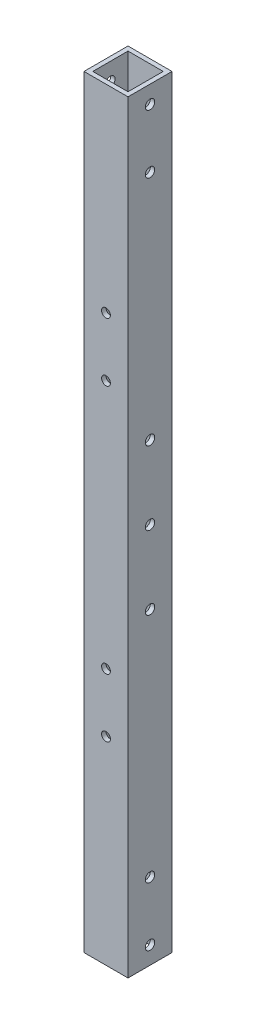
ISO-10303-21;
HEADER;
FILE_DESCRIPTION(('STEP AP214'),'2;1');
FILE_NAME('part.step','',(''),(''),'','','');
FILE_SCHEMA(('AUTOMOTIVE_DESIGN { 1 0 10303 214 1 1 1 1 }'));
ENDSEC;
DATA;
#1=APPLICATION_CONTEXT('core data for automotive mechanical design processes');
#2=APPLICATION_PROTOCOL_DEFINITION('international standard','automotive_design',2000,#1);
#3=PRODUCT_CONTEXT('',#1,'mechanical');
#4=PRODUCT('Part','Part','',(#3));
#5=PRODUCT_RELATED_PRODUCT_CATEGORY('part','',(#4));
#6=PRODUCT_DEFINITION_FORMATION('','',#4);
#7=PRODUCT_DEFINITION_CONTEXT('part definition',#1,'design');
#8=PRODUCT_DEFINITION('design','',#6,#7);
#9=PRODUCT_DEFINITION_SHAPE('','',#8);
#10=(LENGTH_UNIT() NAMED_UNIT(*) SI_UNIT(.MILLI.,.METRE.));
#11=(NAMED_UNIT(*) PLANE_ANGLE_UNIT() SI_UNIT($,.RADIAN.));
#12=(NAMED_UNIT(*) SI_UNIT($,.STERADIAN.) SOLID_ANGLE_UNIT());
#13=UNCERTAINTY_MEASURE_WITH_UNIT(LENGTH_MEASURE(1.E-05),#10,'distance_accuracy_value','');
#14=(GEOMETRIC_REPRESENTATION_CONTEXT(3) GLOBAL_UNCERTAINTY_ASSIGNED_CONTEXT((#13)) GLOBAL_UNIT_ASSIGNED_CONTEXT((#10,
#11,#12)) REPRESENTATION_CONTEXT('',''));
#15=CARTESIAN_POINT('',(0.,0.,0.));
#16=DIRECTION('',(0.,0.,1.));
#17=DIRECTION('',(1.,0.,0.));
#18=AXIS2_PLACEMENT_3D('',#15,#16,#17);
#19=CARTESIAN_POINT('',(0.,260.,0.));
#20=DIRECTION('',(0.,-1.,0.));
#21=DIRECTION('',(0.,0.,-1.));
#22=AXIS2_PLACEMENT_3D('',#19,#20,#21);
#23=PLANE('',#22);
#24=DIRECTION('',(0.,0.,-1.));
#25=VECTOR('',#24,1.);
#26=CARTESIAN_POINT('',(7.5,260.,7.5));
#27=LINE('',#26,#25);
#28=CARTESIAN_POINT('',(7.5,260.,7.5));
#29=VERTEX_POINT('',#28);
#30=CARTESIAN_POINT('',(7.5,260.,-7.5));
#31=VERTEX_POINT('',#30);
#32=EDGE_CURVE('E150',#29,#31,#27,.T.);
#33=ORIENTED_EDGE('',*,*,#32,.T.);
#34=DIRECTION('',(-1.,0.,0.));
#35=VECTOR('',#34,1.);
#36=CARTESIAN_POINT('',(-7.5,260.,-7.5));
#37=LINE('',#36,#35);
#38=CARTESIAN_POINT('',(-7.5,260.,-7.5));
#39=VERTEX_POINT('',#38);
#40=EDGE_CURVE('E153',#31,#39,#37,.T.);
#41=ORIENTED_EDGE('',*,*,#40,.T.);
#42=DIRECTION('',(0.,0.,1.));
#43=VECTOR('',#42,1.);
#44=CARTESIAN_POINT('',(-7.5,260.,7.5));
#45=LINE('',#44,#43);
#46=CARTESIAN_POINT('',(-7.5,260.,7.5));
#47=VERTEX_POINT('',#46);
#48=EDGE_CURVE('E156',#39,#47,#45,.T.);
#49=ORIENTED_EDGE('',*,*,#48,.T.);
#50=DIRECTION('',(1.,0.,0.));
#51=VECTOR('',#50,1.);
#52=CARTESIAN_POINT('',(-7.5,260.,7.5));
#53=LINE('',#52,#51);
#54=EDGE_CURVE('E158',#47,#29,#53,.T.);
#55=ORIENTED_EDGE('',*,*,#54,.T.);
#56=EDGE_LOOP('',(#33,#41,#49,#55));
#57=FACE_BOUND('',#56,.T.);
#58=DIRECTION('',(0.,0.,-1.));
#59=VECTOR('',#58,1.);
#60=CARTESIAN_POINT('',(6.,260.,6.));
#61=LINE('',#60,#59);
#62=CARTESIAN_POINT('',(6.,260.,6.));
#63=VERTEX_POINT('',#62);
#64=CARTESIAN_POINT('',(6.,260.,-6.));
#65=VERTEX_POINT('',#64);
#66=EDGE_CURVE('E112',#63,#65,#61,.T.);
#67=ORIENTED_EDGE('',*,*,#66,.F.);
#68=DIRECTION('',(1.,0.,0.));
#69=VECTOR('',#68,1.);
#70=CARTESIAN_POINT('',(-6.,260.,6.));
#71=LINE('',#70,#69);
#72=CARTESIAN_POINT('',(-6.,260.,6.));
#73=VERTEX_POINT('',#72);
#74=EDGE_CURVE('E134',#73,#63,#71,.T.);
#75=ORIENTED_EDGE('',*,*,#74,.F.);
#76=DIRECTION('',(0.,0.,1.));
#77=VECTOR('',#76,1.);
#78=CARTESIAN_POINT('',(-6.,260.,6.));
#79=LINE('',#78,#77);
#80=CARTESIAN_POINT('',(-6.,260.,-6.));
#81=VERTEX_POINT('',#80);
#82=EDGE_CURVE('E132',#81,#73,#79,.T.);
#83=ORIENTED_EDGE('',*,*,#82,.F.);
#84=DIRECTION('',(-1.,0.,0.));
#85=VECTOR('',#84,1.);
#86=CARTESIAN_POINT('',(-6.,260.,-6.));
#87=LINE('',#86,#85);
#88=EDGE_CURVE('E120',#65,#81,#87,.T.);
#89=ORIENTED_EDGE('',*,*,#88,.F.);
#90=EDGE_LOOP('',(#67,#75,#83,#89));
#91=FACE_BOUND('',#90,.T.);
#92=ADVANCED_FACE('F45',(#57,#91),#23,.F.);
#93=CARTESIAN_POINT('',(0.,0.,0.));
#94=DIRECTION('',(0.,-1.,0.));
#95=DIRECTION('',(0.,0.,-1.));
#96=AXIS2_PLACEMENT_3D('',#93,#94,#95);
#97=PLANE('',#96);
#98=DIRECTION('',(0.,0.,-1.));
#99=VECTOR('',#98,1.);
#100=CARTESIAN_POINT('',(7.5,0.,7.5));
#101=LINE('',#100,#99);
#102=CARTESIAN_POINT('',(7.5,0.,7.5));
#103=VERTEX_POINT('',#102);
#104=CARTESIAN_POINT('',(7.5,0.,-7.5));
#105=VERTEX_POINT('',#104);
#106=EDGE_CURVE('E128',#103,#105,#101,.T.);
#107=ORIENTED_EDGE('',*,*,#106,.F.);
#108=DIRECTION('',(1.,0.,0.));
#109=VECTOR('',#108,1.);
#110=CARTESIAN_POINT('',(-7.5,0.,7.5));
#111=LINE('',#110,#109);
#112=CARTESIAN_POINT('',(-7.5,0.,7.5));
#113=VERTEX_POINT('',#112);
#114=EDGE_CURVE('E154',#113,#103,#111,.T.);
#115=ORIENTED_EDGE('',*,*,#114,.F.);
#116=DIRECTION('',(0.,0.,1.));
#117=VECTOR('',#116,1.);
#118=CARTESIAN_POINT('',(-7.5,0.,7.5));
#119=LINE('',#118,#117);
#120=CARTESIAN_POINT('',(-7.5,0.,-7.5));
#121=VERTEX_POINT('',#120);
#122=EDGE_CURVE('E165',#121,#113,#119,.T.);
#123=ORIENTED_EDGE('',*,*,#122,.F.);
#124=DIRECTION('',(-1.,0.,0.));
#125=VECTOR('',#124,1.);
#126=CARTESIAN_POINT('',(-7.5,0.,-7.5));
#127=LINE('',#126,#125);
#128=EDGE_CURVE('E163',#105,#121,#127,.T.);
#129=ORIENTED_EDGE('',*,*,#128,.F.);
#130=EDGE_LOOP('',(#107,#115,#123,#129));
#131=FACE_BOUND('',#130,.T.);
#132=DIRECTION('',(1.,0.,0.));
#133=VECTOR('',#132,1.);
#134=CARTESIAN_POINT('',(-6.,0.,6.));
#135=LINE('',#134,#133);
#136=CARTESIAN_POINT('',(-6.,0.,6.));
#137=VERTEX_POINT('',#136);
#138=CARTESIAN_POINT('',(6.,0.,6.));
#139=VERTEX_POINT('',#138);
#140=EDGE_CURVE('E121',#137,#139,#135,.T.);
#141=ORIENTED_EDGE('',*,*,#140,.T.);
#142=DIRECTION('',(0.,0.,-1.));
#143=VECTOR('',#142,1.);
#144=CARTESIAN_POINT('',(6.,0.,6.));
#145=LINE('',#144,#143);
#146=CARTESIAN_POINT('',(6.,0.,-6.));
#147=VERTEX_POINT('',#146);
#148=EDGE_CURVE('E70',#139,#147,#145,.T.);
#149=ORIENTED_EDGE('',*,*,#148,.T.);
#150=DIRECTION('',(-1.,0.,0.));
#151=VECTOR('',#150,1.);
#152=CARTESIAN_POINT('',(-6.,0.,-6.));
#153=LINE('',#152,#151);
#154=CARTESIAN_POINT('',(-6.,0.,-6.));
#155=VERTEX_POINT('',#154);
#156=EDGE_CURVE('E127',#147,#155,#153,.T.);
#157=ORIENTED_EDGE('',*,*,#156,.T.);
#158=DIRECTION('',(0.,0.,1.));
#159=VECTOR('',#158,1.);
#160=CARTESIAN_POINT('',(-6.,0.,6.));
#161=LINE('',#160,#159);
#162=EDGE_CURVE('E142',#155,#137,#161,.T.);
#163=ORIENTED_EDGE('',*,*,#162,.T.);
#164=EDGE_LOOP('',(#141,#149,#157,#163));
#165=FACE_BOUND('',#164,.T.);
#166=ADVANCED_FACE('F309',(#131,#165),#97,.T.);
#167=CARTESIAN_POINT('',(7.5,260.,7.5));
#168=DIRECTION('',(-1.,0.,0.));
#169=DIRECTION('',(0.,0.,1.));
#170=AXIS2_PLACEMENT_3D('',#167,#168,#169);
#171=PLANE('',#170);
#172=CARTESIAN_POINT('',(7.5,254.,0.));
#173=DIRECTION('',(-1.,0.,0.));
#174=DIRECTION('',(0.,0.,1.));
#175=AXIS2_PLACEMENT_3D('',#172,#173,#174);
#176=CIRCLE('',#175,1.6);
#177=CARTESIAN_POINT('',(7.5,254.,1.6));
#178=VERTEX_POINT('',#177);
#179=EDGE_CURVE('E140',#178,#178,#176,.T.);
#180=ORIENTED_EDGE('',*,*,#179,.T.);
#181=EDGE_LOOP('',(#180));
#182=FACE_BOUND('',#181,.T.);
#183=CARTESIAN_POINT('',(7.5,234.,0.));
#184=DIRECTION('',(-1.,0.,0.));
#185=DIRECTION('',(0.,0.,1.));
#186=AXIS2_PLACEMENT_3D('',#183,#184,#185);
#187=CIRCLE('',#186,1.6);
#188=CARTESIAN_POINT('',(7.5,234.,1.6));
#189=VERTEX_POINT('',#188);
#190=EDGE_CURVE('E209',#189,#189,#187,.T.);
#191=ORIENTED_EDGE('',*,*,#190,.T.);
#192=EDGE_LOOP('',(#191));
#193=FACE_BOUND('',#192,.T.);
#194=CARTESIAN_POINT('',(7.5,155.,-1.38777878078145E-13));
#195=DIRECTION('',(-1.,0.,0.));
#196=DIRECTION('',(0.,0.,1.));
#197=AXIS2_PLACEMENT_3D('',#194,#195,#196);
#198=CIRCLE('',#197,1.59999999999999);
#199=CARTESIAN_POINT('',(7.5,155.,1.59999999999986));
#200=VERTEX_POINT('',#199);
#201=EDGE_CURVE('E204',#200,#200,#198,.T.);
#202=ORIENTED_EDGE('',*,*,#201,.T.);
#203=EDGE_LOOP('',(#202));
#204=FACE_BOUND('',#203,.T.);
#205=CARTESIAN_POINT('',(7.5,130.,-1.38777878078145E-13));
#206=DIRECTION('',(-1.,0.,0.));
#207=DIRECTION('',(0.,0.,1.));
#208=AXIS2_PLACEMENT_3D('',#205,#206,#207);
#209=CIRCLE('',#208,1.59999999999999);
#210=CARTESIAN_POINT('',(7.5,130.,1.59999999999986));
#211=VERTEX_POINT('',#210);
#212=EDGE_CURVE('E199',#211,#211,#209,.T.);
#213=ORIENTED_EDGE('',*,*,#212,.T.);
#214=EDGE_LOOP('',(#213));
#215=FACE_BOUND('',#214,.T.);
#216=CARTESIAN_POINT('',(7.5,105.,-1.38777878078145E-13));
#217=DIRECTION('',(-1.,0.,0.));
#218=DIRECTION('',(0.,0.,1.));
#219=AXIS2_PLACEMENT_3D('',#216,#217,#218);
#220=CIRCLE('',#219,1.6);
#221=CARTESIAN_POINT('',(7.5,105.,1.59999999999986));
#222=VERTEX_POINT('',#221);
#223=EDGE_CURVE('E194',#222,#222,#220,.T.);
#224=ORIENTED_EDGE('',*,*,#223,.T.);
#225=EDGE_LOOP('',(#224));
#226=FACE_BOUND('',#225,.T.);
#227=CARTESIAN_POINT('',(7.5,26.,0.));
#228=DIRECTION('',(-1.,0.,0.));
#229=DIRECTION('',(0.,0.,1.));
#230=AXIS2_PLACEMENT_3D('',#227,#228,#229);
#231=CIRCLE('',#230,1.6);
#232=CARTESIAN_POINT('',(7.5,26.,1.6));
#233=VERTEX_POINT('',#232);
#234=EDGE_CURVE('E189',#233,#233,#231,.T.);
#235=ORIENTED_EDGE('',*,*,#234,.T.);
#236=EDGE_LOOP('',(#235));
#237=FACE_BOUND('',#236,.T.);
#238=CARTESIAN_POINT('',(7.5,5.99999999999999,0.));
#239=DIRECTION('',(-1.,0.,0.));
#240=DIRECTION('',(0.,0.,1.));
#241=AXIS2_PLACEMENT_3D('',#238,#239,#240);
#242=CIRCLE('',#241,1.6);
#243=CARTESIAN_POINT('',(7.5,5.99999999999999,1.6));
#244=VERTEX_POINT('',#243);
#245=EDGE_CURVE('E184',#244,#244,#242,.T.);
#246=ORIENTED_EDGE('',*,*,#245,.T.);
#247=EDGE_LOOP('',(#246));
#248=FACE_BOUND('',#247,.T.);
#249=ORIENTED_EDGE('',*,*,#106,.T.);
#250=DIRECTION('',(0.,-1.,0.));
#251=VECTOR('',#250,1.);
#252=CARTESIAN_POINT('',(7.5,260.,-7.5));
#253=LINE('',#252,#251);
#254=EDGE_CURVE('E11',#31,#105,#253,.T.);
#255=ORIENTED_EDGE('',*,*,#254,.F.);
#256=ORIENTED_EDGE('',*,*,#32,.F.);
#257=DIRECTION('',(0.,-1.,0.));
#258=VECTOR('',#257,1.);
#259=CARTESIAN_POINT('',(7.5,260.,7.5));
#260=LINE('',#259,#258);
#261=EDGE_CURVE('E160',#29,#103,#260,.T.);
#262=ORIENTED_EDGE('',*,*,#261,.T.);
#263=EDGE_LOOP('',(#249,#255,#256,#262));
#264=FACE_BOUND('',#263,.T.);
#265=ADVANCED_FACE('F47',(#182,#193,#204,#215,#226,#237,#248,#264),#171,.F.);
#266=CARTESIAN_POINT('',(-7.5,260.,-7.5));
#267=DIRECTION('',(0.,0.,1.));
#268=DIRECTION('',(1.,0.,0.));
#269=AXIS2_PLACEMENT_3D('',#266,#267,#268);
#270=PLANE('',#269);
#271=CARTESIAN_POINT('',(1.97397653778353E-12,192.499999999998,-7.5));
#272=DIRECTION('',(0.,0.,1.));
#273=DIRECTION('',(1.,0.,0.));
#274=AXIS2_PLACEMENT_3D('',#271,#272,#273);
#275=CIRCLE('',#274,1.5);
#276=CARTESIAN_POINT('',(1.50000000000198,192.499999999998,-7.5));
#277=VERTEX_POINT('',#276);
#278=EDGE_CURVE('E335',#277,#277,#275,.T.);
#279=ORIENTED_EDGE('',*,*,#278,.T.);
#280=EDGE_LOOP('',(#279));
#281=FACE_BOUND('',#280,.T.);
#282=CARTESIAN_POINT('',(2.21211937656562E-13,67.5,-7.5));
#283=DIRECTION('',(0.,0.,1.));
#284=DIRECTION('',(1.,0.,0.));
#285=AXIS2_PLACEMENT_3D('',#282,#283,#284);
#286=CIRCLE('',#285,1.5);
#287=CARTESIAN_POINT('',(1.50000000000022,67.5,-7.5));
#288=VERTEX_POINT('',#287);
#289=EDGE_CURVE('E339',#288,#288,#286,.T.);
#290=ORIENTED_EDGE('',*,*,#289,.T.);
#291=EDGE_LOOP('',(#290));
#292=FACE_BOUND('',#291,.T.);
#293=CARTESIAN_POINT('',(2.13440376484186E-13,87.5,-7.5));
#294=DIRECTION('',(0.,0.,1.));
#295=DIRECTION('',(1.,0.,0.));
#296=AXIS2_PLACEMENT_3D('',#293,#294,#295);
#297=CIRCLE('',#296,1.5);
#298=CARTESIAN_POINT('',(1.50000000000022,87.5,-7.5));
#299=VERTEX_POINT('',#298);
#300=EDGE_CURVE('E343',#299,#299,#297,.T.);
#301=ORIENTED_EDGE('',*,*,#300,.T.);
#302=EDGE_LOOP('',(#301));
#303=FACE_BOUND('',#302,.T.);
#304=CARTESIAN_POINT('',(1.75526260193237E-12,172.499999999998,-7.5));
#305=DIRECTION('',(0.,0.,1.));
#306=DIRECTION('',(1.,0.,0.));
#307=AXIS2_PLACEMENT_3D('',#304,#305,#306);
#308=CIRCLE('',#307,1.5);
#309=CARTESIAN_POINT('',(1.50000000000176,172.499999999998,-7.5));
#310=VERTEX_POINT('',#309);
#311=EDGE_CURVE('E214',#310,#310,#308,.T.);
#312=ORIENTED_EDGE('',*,*,#311,.T.);
#313=EDGE_LOOP('',(#312));
#314=FACE_BOUND('',#313,.T.);
#315=ORIENTED_EDGE('',*,*,#128,.T.);
#316=DIRECTION('',(0.,-1.,0.));
#317=VECTOR('',#316,1.);
#318=CARTESIAN_POINT('',(-7.5,260.,-7.5));
#319=LINE('',#318,#317);
#320=EDGE_CURVE('E54',#39,#121,#319,.T.);
#321=ORIENTED_EDGE('',*,*,#320,.F.);
#322=ORIENTED_EDGE('',*,*,#40,.F.);
#323=ORIENTED_EDGE('',*,*,#254,.T.);
#324=EDGE_LOOP('',(#315,#321,#322,#323));
#325=FACE_BOUND('',#324,.T.);
#326=ADVANCED_FACE('F326',(#281,#292,#303,#314,#325),#270,.F.);
#327=CARTESIAN_POINT('',(-7.5,260.,7.5));
#328=DIRECTION('',(1.,0.,0.));
#329=DIRECTION('',(0.,0.,-1.));
#330=AXIS2_PLACEMENT_3D('',#327,#328,#329);
#331=PLANE('',#330);
#332=CARTESIAN_POINT('',(-7.5,254.,0.));
#333=DIRECTION('',(1.,0.,0.));
#334=DIRECTION('',(0.,0.,-1.));
#335=AXIS2_PLACEMENT_3D('',#332,#333,#334);
#336=CIRCLE('',#335,1.6);
#337=CARTESIAN_POINT('',(-7.5,254.,-1.6));
#338=VERTEX_POINT('',#337);
#339=EDGE_CURVE('E179',#338,#338,#336,.T.);
#340=ORIENTED_EDGE('',*,*,#339,.T.);
#341=EDGE_LOOP('',(#340));
#342=FACE_BOUND('',#341,.T.);
#343=CARTESIAN_POINT('',(-7.5,234.,0.));
#344=DIRECTION('',(1.,0.,0.));
#345=DIRECTION('',(0.,0.,-1.));
#346=AXIS2_PLACEMENT_3D('',#343,#344,#345);
#347=CIRCLE('',#346,1.6);
#348=CARTESIAN_POINT('',(-7.5,234.,-1.6));
#349=VERTEX_POINT('',#348);
#350=EDGE_CURVE('E238',#349,#349,#347,.T.);
#351=ORIENTED_EDGE('',*,*,#350,.T.);
#352=EDGE_LOOP('',(#351));
#353=FACE_BOUND('',#352,.T.);
#354=CARTESIAN_POINT('',(-7.5,155.,-1.38777878078145E-13));
#355=DIRECTION('',(1.,0.,0.));
#356=DIRECTION('',(0.,0.,-1.));
#357=AXIS2_PLACEMENT_3D('',#354,#355,#356);
#358=CIRCLE('',#357,1.59999999999999);
#359=CARTESIAN_POINT('',(-7.5,155.,-1.60000000000013));
#360=VERTEX_POINT('',#359);
#361=EDGE_CURVE('E241',#360,#360,#358,.T.);
#362=ORIENTED_EDGE('',*,*,#361,.T.);
#363=EDGE_LOOP('',(#362));
#364=FACE_BOUND('',#363,.T.);
#365=CARTESIAN_POINT('',(-7.5,130.,-1.38777878078145E-13));
#366=DIRECTION('',(1.,0.,0.));
#367=DIRECTION('',(0.,0.,-1.));
#368=AXIS2_PLACEMENT_3D('',#365,#366,#367);
#369=CIRCLE('',#368,1.59999999999999);
#370=CARTESIAN_POINT('',(-7.5,130.,-1.60000000000013));
#371=VERTEX_POINT('',#370);
#372=EDGE_CURVE('E244',#371,#371,#369,.T.);
#373=ORIENTED_EDGE('',*,*,#372,.T.);
#374=EDGE_LOOP('',(#373));
#375=FACE_BOUND('',#374,.T.);
#376=CARTESIAN_POINT('',(-7.5,105.,-1.38777878078145E-13));
#377=DIRECTION('',(1.,0.,0.));
#378=DIRECTION('',(0.,0.,-1.));
#379=AXIS2_PLACEMENT_3D('',#376,#377,#378);
#380=CIRCLE('',#379,1.6);
#381=CARTESIAN_POINT('',(-7.5,105.,-1.60000000000014));
#382=VERTEX_POINT('',#381);
#383=EDGE_CURVE('E247',#382,#382,#380,.T.);
#384=ORIENTED_EDGE('',*,*,#383,.T.);
#385=EDGE_LOOP('',(#384));
#386=FACE_BOUND('',#385,.T.);
#387=CARTESIAN_POINT('',(-7.5,26.,0.));
#388=DIRECTION('',(1.,0.,0.));
#389=DIRECTION('',(0.,0.,-1.));
#390=AXIS2_PLACEMENT_3D('',#387,#388,#389);
#391=CIRCLE('',#390,1.6);
#392=CARTESIAN_POINT('',(-7.5,26.,-1.6));
#393=VERTEX_POINT('',#392);
#394=EDGE_CURVE('E250',#393,#393,#391,.T.);
#395=ORIENTED_EDGE('',*,*,#394,.T.);
#396=EDGE_LOOP('',(#395));
#397=FACE_BOUND('',#396,.T.);
#398=CARTESIAN_POINT('',(-7.5,5.99999999999999,0.));
#399=DIRECTION('',(1.,0.,0.));
#400=DIRECTION('',(0.,0.,-1.));
#401=AXIS2_PLACEMENT_3D('',#398,#399,#400);
#402=CIRCLE('',#401,1.6);
#403=CARTESIAN_POINT('',(-7.5,5.99999999999999,-1.6));
#404=VERTEX_POINT('',#403);
#405=EDGE_CURVE('E235',#404,#404,#402,.T.);
#406=ORIENTED_EDGE('',*,*,#405,.T.);
#407=EDGE_LOOP('',(#406));
#408=FACE_BOUND('',#407,.T.);
#409=ORIENTED_EDGE('',*,*,#122,.T.);
#410=DIRECTION('',(0.,-1.,0.));
#411=VECTOR('',#410,1.);
#412=CARTESIAN_POINT('',(-7.5,260.,7.5));
#413=LINE('',#412,#411);
#414=EDGE_CURVE('E170',#47,#113,#413,.T.);
#415=ORIENTED_EDGE('',*,*,#414,.F.);
#416=ORIENTED_EDGE('',*,*,#48,.F.);
#417=ORIENTED_EDGE('',*,*,#320,.T.);
#418=EDGE_LOOP('',(#409,#415,#416,#417));
#419=FACE_BOUND('',#418,.T.);
#420=ADVANCED_FACE('F323',(#342,#353,#364,#375,#386,#397,#408,#419),#331,.F.);
#421=CARTESIAN_POINT('',(-7.5,260.,7.5));
#422=DIRECTION('',(0.,0.,-1.));
#423=DIRECTION('',(-1.,0.,0.));
#424=AXIS2_PLACEMENT_3D('',#421,#422,#423);
#425=PLANE('',#424);
#426=CARTESIAN_POINT('',(1.97397653778353E-12,192.499999999998,7.5));
#427=DIRECTION('',(0.,0.,1.));
#428=DIRECTION('',(1.,0.,0.));
#429=AXIS2_PLACEMENT_3D('',#426,#427,#428);
#430=CIRCLE('',#429,1.5);
#431=CARTESIAN_POINT('',(1.50000000000198,192.499999999998,7.5));
#432=VERTEX_POINT('',#431);
#433=EDGE_CURVE('E401',#432,#432,#430,.T.);
#434=ORIENTED_EDGE('',*,*,#433,.F.);
#435=EDGE_LOOP('',(#434));
#436=FACE_BOUND('',#435,.T.);
#437=CARTESIAN_POINT('',(2.21211937656562E-13,67.5,7.5));
#438=DIRECTION('',(0.,0.,1.));
#439=DIRECTION('',(1.,0.,0.));
#440=AXIS2_PLACEMENT_3D('',#437,#438,#439);
#441=CIRCLE('',#440,1.5);
#442=CARTESIAN_POINT('',(1.50000000000022,67.5,7.5));
#443=VERTEX_POINT('',#442);
#444=EDGE_CURVE('E404',#443,#443,#441,.T.);
#445=ORIENTED_EDGE('',*,*,#444,.F.);
#446=EDGE_LOOP('',(#445));
#447=FACE_BOUND('',#446,.T.);
#448=CARTESIAN_POINT('',(2.13440376484186E-13,87.5,7.5));
#449=DIRECTION('',(0.,0.,1.));
#450=DIRECTION('',(1.,0.,0.));
#451=AXIS2_PLACEMENT_3D('',#448,#449,#450);
#452=CIRCLE('',#451,1.5);
#453=CARTESIAN_POINT('',(1.50000000000022,87.5,7.5));
#454=VERTEX_POINT('',#453);
#455=EDGE_CURVE('E405',#454,#454,#452,.T.);
#456=ORIENTED_EDGE('',*,*,#455,.F.);
#457=EDGE_LOOP('',(#456));
#458=FACE_BOUND('',#457,.T.);
#459=CARTESIAN_POINT('',(1.75526260193237E-12,172.499999999998,7.5));
#460=DIRECTION('',(0.,0.,1.));
#461=DIRECTION('',(1.,0.,0.));
#462=AXIS2_PLACEMENT_3D('',#459,#460,#461);
#463=CIRCLE('',#462,1.5);
#464=CARTESIAN_POINT('',(1.50000000000176,172.499999999998,7.5));
#465=VERTEX_POINT('',#464);
#466=EDGE_CURVE('E398',#465,#465,#463,.T.);
#467=ORIENTED_EDGE('',*,*,#466,.F.);
#468=EDGE_LOOP('',(#467));
#469=FACE_BOUND('',#468,.T.);
#470=ORIENTED_EDGE('',*,*,#114,.T.);
#471=ORIENTED_EDGE('',*,*,#261,.F.);
#472=ORIENTED_EDGE('',*,*,#54,.F.);
#473=ORIENTED_EDGE('',*,*,#414,.T.);
#474=EDGE_LOOP('',(#470,#471,#472,#473));
#475=FACE_BOUND('',#474,.T.);
#476=ADVANCED_FACE('F320',(#436,#447,#458,#469,#475),#425,.F.);
#477=CARTESIAN_POINT('',(6.,260.,6.));
#478=DIRECTION('',(-1.,0.,0.));
#479=DIRECTION('',(0.,0.,1.));
#480=AXIS2_PLACEMENT_3D('',#477,#478,#479);
#481=PLANE('',#480);
#482=CARTESIAN_POINT('',(6.,254.,0.));
#483=DIRECTION('',(-1.,0.,0.));
#484=DIRECTION('',(0.,0.,1.));
#485=AXIS2_PLACEMENT_3D('',#482,#483,#484);
#486=CIRCLE('',#485,1.6);
#487=CARTESIAN_POINT('',(6.,254.,1.6));
#488=VERTEX_POINT('',#487);
#489=EDGE_CURVE('E208',#488,#488,#486,.T.);
#490=ORIENTED_EDGE('',*,*,#489,.F.);
#491=EDGE_LOOP('',(#490));
#492=FACE_BOUND('',#491,.T.);
#493=CARTESIAN_POINT('',(6.,234.,0.));
#494=DIRECTION('',(-1.,0.,0.));
#495=DIRECTION('',(0.,0.,1.));
#496=AXIS2_PLACEMENT_3D('',#493,#494,#495);
#497=CIRCLE('',#496,1.6);
#498=CARTESIAN_POINT('',(6.,234.,1.6));
#499=VERTEX_POINT('',#498);
#500=EDGE_CURVE('E203',#499,#499,#497,.T.);
#501=ORIENTED_EDGE('',*,*,#500,.F.);
#502=EDGE_LOOP('',(#501));
#503=FACE_BOUND('',#502,.T.);
#504=CARTESIAN_POINT('',(6.,155.,-1.38777878078145E-13));
#505=DIRECTION('',(-1.,0.,0.));
#506=DIRECTION('',(0.,0.,1.));
#507=AXIS2_PLACEMENT_3D('',#504,#505,#506);
#508=CIRCLE('',#507,1.59999999999999);
#509=CARTESIAN_POINT('',(6.,155.,1.59999999999986));
#510=VERTEX_POINT('',#509);
#511=EDGE_CURVE('E198',#510,#510,#508,.T.);
#512=ORIENTED_EDGE('',*,*,#511,.F.);
#513=EDGE_LOOP('',(#512));
#514=FACE_BOUND('',#513,.T.);
#515=CARTESIAN_POINT('',(6.,130.,-1.38777878078145E-13));
#516=DIRECTION('',(-1.,0.,0.));
#517=DIRECTION('',(0.,0.,1.));
#518=AXIS2_PLACEMENT_3D('',#515,#516,#517);
#519=CIRCLE('',#518,1.59999999999999);
#520=CARTESIAN_POINT('',(6.,130.,1.59999999999986));
#521=VERTEX_POINT('',#520);
#522=EDGE_CURVE('E193',#521,#521,#519,.T.);
#523=ORIENTED_EDGE('',*,*,#522,.F.);
#524=EDGE_LOOP('',(#523));
#525=FACE_BOUND('',#524,.T.);
#526=CARTESIAN_POINT('',(6.,105.,-1.38777878078145E-13));
#527=DIRECTION('',(-1.,0.,0.));
#528=DIRECTION('',(0.,0.,1.));
#529=AXIS2_PLACEMENT_3D('',#526,#527,#528);
#530=CIRCLE('',#529,1.6);
#531=CARTESIAN_POINT('',(6.,105.,1.59999999999986));
#532=VERTEX_POINT('',#531);
#533=EDGE_CURVE('E188',#532,#532,#530,.T.);
#534=ORIENTED_EDGE('',*,*,#533,.F.);
#535=EDGE_LOOP('',(#534));
#536=FACE_BOUND('',#535,.T.);
#537=CARTESIAN_POINT('',(6.,26.,0.));
#538=DIRECTION('',(-1.,0.,0.));
#539=DIRECTION('',(0.,0.,1.));
#540=AXIS2_PLACEMENT_3D('',#537,#538,#539);
#541=CIRCLE('',#540,1.6);
#542=CARTESIAN_POINT('',(6.,26.,1.6));
#543=VERTEX_POINT('',#542);
#544=EDGE_CURVE('E183',#543,#543,#541,.T.);
#545=ORIENTED_EDGE('',*,*,#544,.F.);
#546=EDGE_LOOP('',(#545));
#547=FACE_BOUND('',#546,.T.);
#548=CARTESIAN_POINT('',(6.,5.99999999999999,0.));
#549=DIRECTION('',(-1.,0.,0.));
#550=DIRECTION('',(0.,0.,1.));
#551=AXIS2_PLACEMENT_3D('',#548,#549,#550);
#552=CIRCLE('',#551,1.6);
#553=CARTESIAN_POINT('',(6.,5.99999999999999,1.6));
#554=VERTEX_POINT('',#553);
#555=EDGE_CURVE('E178',#554,#554,#552,.T.);
#556=ORIENTED_EDGE('',*,*,#555,.F.);
#557=EDGE_LOOP('',(#556));
#558=FACE_BOUND('',#557,.T.);
#559=ORIENTED_EDGE('',*,*,#148,.F.);
#560=DIRECTION('',(0.,-1.,0.));
#561=VECTOR('',#560,1.);
#562=CARTESIAN_POINT('',(6.,260.,6.));
#563=LINE('',#562,#561);
#564=EDGE_CURVE('E116',#63,#139,#563,.T.);
#565=ORIENTED_EDGE('',*,*,#564,.F.);
#566=ORIENTED_EDGE('',*,*,#66,.T.);
#567=DIRECTION('',(0.,-1.,0.));
#568=VECTOR('',#567,1.);
#569=CARTESIAN_POINT('',(6.,260.,-6.));
#570=LINE('',#569,#568);
#571=EDGE_CURVE('E115',#65,#147,#570,.T.);
#572=ORIENTED_EDGE('',*,*,#571,.T.);
#573=EDGE_LOOP('',(#559,#565,#566,#572));
#574=FACE_BOUND('',#573,.T.);
#575=ADVANCED_FACE('F114',(#492,#503,#514,#525,#536,#547,#558,#574),#481,.T.);
#576=CARTESIAN_POINT('',(-6.,260.,-6.));
#577=DIRECTION('',(0.,0.,1.));
#578=DIRECTION('',(1.,0.,0.));
#579=AXIS2_PLACEMENT_3D('',#576,#577,#578);
#580=PLANE('',#579);
#581=CARTESIAN_POINT('',(1.97397653778353E-12,192.499999999998,-6.));
#582=DIRECTION('',(0.,0.,1.));
#583=DIRECTION('',(1.,0.,0.));
#584=AXIS2_PLACEMENT_3D('',#581,#582,#583);
#585=CIRCLE('',#584,1.5);
#586=CARTESIAN_POINT('',(1.50000000000198,192.499999999998,-6.));
#587=VERTEX_POINT('',#586);
#588=EDGE_CURVE('E232',#587,#587,#585,.T.);
#589=ORIENTED_EDGE('',*,*,#588,.F.);
#590=EDGE_LOOP('',(#589));
#591=FACE_BOUND('',#590,.T.);
#592=CARTESIAN_POINT('',(2.21211937656562E-13,67.5,-6.));
#593=DIRECTION('',(0.,0.,1.));
#594=DIRECTION('',(1.,0.,0.));
#595=AXIS2_PLACEMENT_3D('',#592,#593,#594);
#596=CIRCLE('',#595,1.5);
#597=CARTESIAN_POINT('',(1.50000000000022,67.5,-6.));
#598=VERTEX_POINT('',#597);
#599=EDGE_CURVE('E220',#598,#598,#596,.T.);
#600=ORIENTED_EDGE('',*,*,#599,.F.);
#601=EDGE_LOOP('',(#600));
#602=FACE_BOUND('',#601,.T.);
#603=CARTESIAN_POINT('',(2.13440376484186E-13,87.5,-6.));
#604=DIRECTION('',(0.,0.,1.));
#605=DIRECTION('',(1.,0.,0.));
#606=AXIS2_PLACEMENT_3D('',#603,#604,#605);
#607=CIRCLE('',#606,1.5);
#608=CARTESIAN_POINT('',(1.50000000000022,87.5,-6.));
#609=VERTEX_POINT('',#608);
#610=EDGE_CURVE('E217',#609,#609,#607,.T.);
#611=ORIENTED_EDGE('',*,*,#610,.F.);
#612=EDGE_LOOP('',(#611));
#613=FACE_BOUND('',#612,.T.);
#614=CARTESIAN_POINT('',(1.75526260193237E-12,172.499999999998,-6.));
#615=DIRECTION('',(0.,0.,1.));
#616=DIRECTION('',(1.,0.,0.));
#617=AXIS2_PLACEMENT_3D('',#614,#615,#616);
#618=CIRCLE('',#617,1.5);
#619=CARTESIAN_POINT('',(1.50000000000176,172.499999999998,-6.));
#620=VERTEX_POINT('',#619);
#621=EDGE_CURVE('E213',#620,#620,#618,.T.);
#622=ORIENTED_EDGE('',*,*,#621,.F.);
#623=EDGE_LOOP('',(#622));
#624=FACE_BOUND('',#623,.T.);
#625=ORIENTED_EDGE('',*,*,#156,.F.);
#626=ORIENTED_EDGE('',*,*,#571,.F.);
#627=ORIENTED_EDGE('',*,*,#88,.T.);
#628=DIRECTION('',(0.,-1.,0.));
#629=VECTOR('',#628,1.);
#630=CARTESIAN_POINT('',(-6.,260.,-6.));
#631=LINE('',#630,#629);
#632=EDGE_CURVE('E129',#81,#155,#631,.T.);
#633=ORIENTED_EDGE('',*,*,#632,.T.);
#634=EDGE_LOOP('',(#625,#626,#627,#633));
#635=FACE_BOUND('',#634,.T.);
#636=ADVANCED_FACE('F124',(#591,#602,#613,#624,#635),#580,.T.);
#637=CARTESIAN_POINT('',(-6.,260.,6.));
#638=DIRECTION('',(1.,0.,0.));
#639=DIRECTION('',(0.,0.,-1.));
#640=AXIS2_PLACEMENT_3D('',#637,#638,#639);
#641=PLANE('',#640);
#642=CARTESIAN_POINT('',(-6.,254.,0.));
#643=DIRECTION('',(1.,0.,0.));
#644=DIRECTION('',(0.,0.,-1.));
#645=AXIS2_PLACEMENT_3D('',#642,#643,#644);
#646=CIRCLE('',#645,1.6);
#647=CARTESIAN_POINT('',(-6.,254.,-1.6));
#648=VERTEX_POINT('',#647);
#649=EDGE_CURVE('E205',#648,#648,#646,.T.);
#650=ORIENTED_EDGE('',*,*,#649,.F.);
#651=EDGE_LOOP('',(#650));
#652=FACE_BOUND('',#651,.T.);
#653=CARTESIAN_POINT('',(-6.,234.,0.));
#654=DIRECTION('',(1.,0.,0.));
#655=DIRECTION('',(0.,0.,-1.));
#656=AXIS2_PLACEMENT_3D('',#653,#654,#655);
#657=CIRCLE('',#656,1.6);
#658=CARTESIAN_POINT('',(-6.,234.,-1.6));
#659=VERTEX_POINT('',#658);
#660=EDGE_CURVE('E200',#659,#659,#657,.T.);
#661=ORIENTED_EDGE('',*,*,#660,.F.);
#662=EDGE_LOOP('',(#661));
#663=FACE_BOUND('',#662,.T.);
#664=CARTESIAN_POINT('',(-6.,155.,-1.38777878078145E-13));
#665=DIRECTION('',(1.,0.,0.));
#666=DIRECTION('',(0.,0.,-1.));
#667=AXIS2_PLACEMENT_3D('',#664,#665,#666);
#668=CIRCLE('',#667,1.59999999999999);
#669=CARTESIAN_POINT('',(-6.,155.,-1.60000000000013));
#670=VERTEX_POINT('',#669);
#671=EDGE_CURVE('E195',#670,#670,#668,.T.);
#672=ORIENTED_EDGE('',*,*,#671,.F.);
#673=EDGE_LOOP('',(#672));
#674=FACE_BOUND('',#673,.T.);
#675=CARTESIAN_POINT('',(-6.,130.,-1.38777878078145E-13));
#676=DIRECTION('',(1.,0.,0.));
#677=DIRECTION('',(0.,0.,-1.));
#678=AXIS2_PLACEMENT_3D('',#675,#676,#677);
#679=CIRCLE('',#678,1.59999999999999);
#680=CARTESIAN_POINT('',(-6.,130.,-1.60000000000013));
#681=VERTEX_POINT('',#680);
#682=EDGE_CURVE('E190',#681,#681,#679,.T.);
#683=ORIENTED_EDGE('',*,*,#682,.F.);
#684=EDGE_LOOP('',(#683));
#685=FACE_BOUND('',#684,.T.);
#686=CARTESIAN_POINT('',(-6.,105.,-1.38777878078145E-13));
#687=DIRECTION('',(1.,0.,0.));
#688=DIRECTION('',(0.,0.,-1.));
#689=AXIS2_PLACEMENT_3D('',#686,#687,#688);
#690=CIRCLE('',#689,1.6);
#691=CARTESIAN_POINT('',(-6.,105.,-1.60000000000014));
#692=VERTEX_POINT('',#691);
#693=EDGE_CURVE('E185',#692,#692,#690,.T.);
#694=ORIENTED_EDGE('',*,*,#693,.F.);
#695=EDGE_LOOP('',(#694));
#696=FACE_BOUND('',#695,.T.);
#697=CARTESIAN_POINT('',(-6.,26.,0.));
#698=DIRECTION('',(1.,0.,0.));
#699=DIRECTION('',(0.,0.,-1.));
#700=AXIS2_PLACEMENT_3D('',#697,#698,#699);
#701=CIRCLE('',#700,1.6);
#702=CARTESIAN_POINT('',(-6.,26.,-1.6));
#703=VERTEX_POINT('',#702);
#704=EDGE_CURVE('E180',#703,#703,#701,.T.);
#705=ORIENTED_EDGE('',*,*,#704,.F.);
#706=EDGE_LOOP('',(#705));
#707=FACE_BOUND('',#706,.T.);
#708=CARTESIAN_POINT('',(-6.,5.99999999999999,0.));
#709=DIRECTION('',(1.,0.,0.));
#710=DIRECTION('',(0.,0.,-1.));
#711=AXIS2_PLACEMENT_3D('',#708,#709,#710);
#712=CIRCLE('',#711,1.6);
#713=CARTESIAN_POINT('',(-6.,5.99999999999999,-1.6));
#714=VERTEX_POINT('',#713);
#715=EDGE_CURVE('E175',#714,#714,#712,.T.);
#716=ORIENTED_EDGE('',*,*,#715,.F.);
#717=EDGE_LOOP('',(#716));
#718=FACE_BOUND('',#717,.T.);
#719=ORIENTED_EDGE('',*,*,#162,.F.);
#720=ORIENTED_EDGE('',*,*,#632,.F.);
#721=ORIENTED_EDGE('',*,*,#82,.T.);
#722=DIRECTION('',(0.,-1.,0.));
#723=VECTOR('',#722,1.);
#724=CARTESIAN_POINT('',(-6.,260.,6.));
#725=LINE('',#724,#723);
#726=EDGE_CURVE('E62',#73,#137,#725,.T.);
#727=ORIENTED_EDGE('',*,*,#726,.T.);
#728=EDGE_LOOP('',(#719,#720,#721,#727));
#729=FACE_BOUND('',#728,.T.);
#730=ADVANCED_FACE('F365',(#652,#663,#674,#685,#696,#707,#718,#729),#641,.T.);
#731=CARTESIAN_POINT('',(-6.,260.,6.));
#732=DIRECTION('',(0.,0.,-1.));
#733=DIRECTION('',(-1.,0.,0.));
#734=AXIS2_PLACEMENT_3D('',#731,#732,#733);
#735=PLANE('',#734);
#736=CARTESIAN_POINT('',(1.97397653778353E-12,192.499999999998,6.));
#737=DIRECTION('',(0.,0.,-1.));
#738=DIRECTION('',(-1.,0.,0.));
#739=AXIS2_PLACEMENT_3D('',#736,#737,#738);
#740=CIRCLE('',#739,1.5);
#741=CARTESIAN_POINT('',(-1.49999999999803,192.499999999998,6.));
#742=VERTEX_POINT('',#741);
#743=EDGE_CURVE('E49',#742,#742,#740,.T.);
#744=ORIENTED_EDGE('',*,*,#743,.F.);
#745=EDGE_LOOP('',(#744));
#746=FACE_BOUND('',#745,.T.);
#747=CARTESIAN_POINT('',(2.21211937656562E-13,67.5,6.));
#748=DIRECTION('',(0.,0.,-1.));
#749=DIRECTION('',(-1.,0.,0.));
#750=AXIS2_PLACEMENT_3D('',#747,#748,#749);
#751=CIRCLE('',#750,1.5);
#752=CARTESIAN_POINT('',(-1.49999999999978,67.5,6.));
#753=VERTEX_POINT('',#752);
#754=EDGE_CURVE('E218',#753,#753,#751,.T.);
#755=ORIENTED_EDGE('',*,*,#754,.F.);
#756=EDGE_LOOP('',(#755));
#757=FACE_BOUND('',#756,.T.);
#758=CARTESIAN_POINT('',(2.13440376484186E-13,87.5,6.));
#759=DIRECTION('',(0.,0.,-1.));
#760=DIRECTION('',(-1.,0.,0.));
#761=AXIS2_PLACEMENT_3D('',#758,#759,#760);
#762=CIRCLE('',#761,1.5);
#763=CARTESIAN_POINT('',(-1.49999999999979,87.5,6.));
#764=VERTEX_POINT('',#763);
#765=EDGE_CURVE('E215',#764,#764,#762,.T.);
#766=ORIENTED_EDGE('',*,*,#765,.F.);
#767=EDGE_LOOP('',(#766));
#768=FACE_BOUND('',#767,.T.);
#769=CARTESIAN_POINT('',(1.75526260193237E-12,172.499999999998,6.));
#770=DIRECTION('',(0.,0.,-1.));
#771=DIRECTION('',(-1.,0.,0.));
#772=AXIS2_PLACEMENT_3D('',#769,#770,#771);
#773=CIRCLE('',#772,1.5);
#774=CARTESIAN_POINT('',(-1.49999999999825,172.499999999998,6.));
#775=VERTEX_POINT('',#774);
#776=EDGE_CURVE('E210',#775,#775,#773,.T.);
#777=ORIENTED_EDGE('',*,*,#776,.F.);
#778=EDGE_LOOP('',(#777));
#779=FACE_BOUND('',#778,.T.);
#780=ORIENTED_EDGE('',*,*,#140,.F.);
#781=ORIENTED_EDGE('',*,*,#726,.F.);
#782=ORIENTED_EDGE('',*,*,#74,.T.);
#783=ORIENTED_EDGE('',*,*,#564,.T.);
#784=EDGE_LOOP('',(#780,#781,#782,#783));
#785=FACE_BOUND('',#784,.T.);
#786=ADVANCED_FACE('F362',(#746,#757,#768,#779,#785),#735,.T.);
#787=CARTESIAN_POINT('',(-7.5,5.99999999999999,0.));
#788=DIRECTION('',(1.,0.,0.));
#789=DIRECTION('',(0.,0.,-1.));
#790=AXIS2_PLACEMENT_3D('',#787,#788,#789);
#791=CYLINDRICAL_SURFACE('',#790,1.6);
#792=ORIENTED_EDGE('',*,*,#715,.T.);
#793=EDGE_LOOP('',(#792));
#794=FACE_BOUND('',#793,.T.);
#795=ORIENTED_EDGE('',*,*,#405,.F.);
#796=EDGE_LOOP('',(#795));
#797=FACE_BOUND('',#796,.T.);
#798=ADVANCED_FACE('F364',(#794,#797),#791,.F.);
#799=CARTESIAN_POINT('',(-7.5,26.,0.));
#800=DIRECTION('',(1.,0.,0.));
#801=DIRECTION('',(0.,0.,-1.));
#802=AXIS2_PLACEMENT_3D('',#799,#800,#801);
#803=CYLINDRICAL_SURFACE('',#802,1.6);
#804=ORIENTED_EDGE('',*,*,#704,.T.);
#805=EDGE_LOOP('',(#804));
#806=FACE_BOUND('',#805,.T.);
#807=ORIENTED_EDGE('',*,*,#394,.F.);
#808=EDGE_LOOP('',(#807));
#809=FACE_BOUND('',#808,.T.);
#810=ADVANCED_FACE('F372',(#806,#809),#803,.F.);
#811=CARTESIAN_POINT('',(-7.5,105.,-1.38777878078145E-13));
#812=DIRECTION('',(1.,0.,0.));
#813=DIRECTION('',(0.,0.,-1.));
#814=AXIS2_PLACEMENT_3D('',#811,#812,#813);
#815=CYLINDRICAL_SURFACE('',#814,1.6);
#816=ORIENTED_EDGE('',*,*,#693,.T.);
#817=EDGE_LOOP('',(#816));
#818=FACE_BOUND('',#817,.T.);
#819=ORIENTED_EDGE('',*,*,#383,.F.);
#820=EDGE_LOOP('',(#819));
#821=FACE_BOUND('',#820,.T.);
#822=ADVANCED_FACE('F527',(#818,#821),#815,.F.);
#823=CARTESIAN_POINT('',(-7.5,130.,-1.38777878078145E-13));
#824=DIRECTION('',(1.,0.,0.));
#825=DIRECTION('',(0.,0.,-1.));
#826=AXIS2_PLACEMENT_3D('',#823,#824,#825);
#827=CYLINDRICAL_SURFACE('',#826,1.59999999999999);
#828=ORIENTED_EDGE('',*,*,#682,.T.);
#829=EDGE_LOOP('',(#828));
#830=FACE_BOUND('',#829,.T.);
#831=ORIENTED_EDGE('',*,*,#372,.F.);
#832=EDGE_LOOP('',(#831));
#833=FACE_BOUND('',#832,.T.);
#834=ADVANCED_FACE('F517',(#830,#833),#827,.F.);
#835=CARTESIAN_POINT('',(-7.5,155.,-1.38777878078145E-13));
#836=DIRECTION('',(1.,0.,0.));
#837=DIRECTION('',(0.,0.,-1.));
#838=AXIS2_PLACEMENT_3D('',#835,#836,#837);
#839=CYLINDRICAL_SURFACE('',#838,1.59999999999999);
#840=ORIENTED_EDGE('',*,*,#671,.T.);
#841=EDGE_LOOP('',(#840));
#842=FACE_BOUND('',#841,.T.);
#843=ORIENTED_EDGE('',*,*,#361,.F.);
#844=EDGE_LOOP('',(#843));
#845=FACE_BOUND('',#844,.T.);
#846=ADVANCED_FACE('F507',(#842,#845),#839,.F.);
#847=CARTESIAN_POINT('',(-7.5,234.,0.));
#848=DIRECTION('',(1.,0.,0.));
#849=DIRECTION('',(0.,0.,-1.));
#850=AXIS2_PLACEMENT_3D('',#847,#848,#849);
#851=CYLINDRICAL_SURFACE('',#850,1.6);
#852=ORIENTED_EDGE('',*,*,#660,.T.);
#853=EDGE_LOOP('',(#852));
#854=FACE_BOUND('',#853,.T.);
#855=ORIENTED_EDGE('',*,*,#350,.F.);
#856=EDGE_LOOP('',(#855));
#857=FACE_BOUND('',#856,.T.);
#858=ADVANCED_FACE('F304',(#854,#857),#851,.F.);
#859=CARTESIAN_POINT('',(-7.5,254.,0.));
#860=DIRECTION('',(1.,0.,0.));
#861=DIRECTION('',(0.,0.,-1.));
#862=AXIS2_PLACEMENT_3D('',#859,#860,#861);
#863=CYLINDRICAL_SURFACE('',#862,1.6);
#864=ORIENTED_EDGE('',*,*,#649,.T.);
#865=EDGE_LOOP('',(#864));
#866=FACE_BOUND('',#865,.T.);
#867=ORIENTED_EDGE('',*,*,#339,.F.);
#868=EDGE_LOOP('',(#867));
#869=FACE_BOUND('',#868,.T.);
#870=ADVANCED_FACE('F291',(#866,#869),#863,.F.);
#871=ORIENTED_EDGE('',*,*,#555,.T.);
#872=EDGE_LOOP('',(#871));
#873=FACE_BOUND('',#872,.T.);
#874=ORIENTED_EDGE('',*,*,#245,.F.);
#875=EDGE_LOOP('',(#874));
#876=FACE_BOUND('',#875,.T.);
#877=ADVANCED_FACE('F306',(#873,#876),#791,.F.);
#878=ORIENTED_EDGE('',*,*,#544,.T.);
#879=EDGE_LOOP('',(#878));
#880=FACE_BOUND('',#879,.T.);
#881=ORIENTED_EDGE('',*,*,#234,.F.);
#882=EDGE_LOOP('',(#881));
#883=FACE_BOUND('',#882,.T.);
#884=ADVANCED_FACE('F524',(#880,#883),#803,.F.);
#885=ORIENTED_EDGE('',*,*,#533,.T.);
#886=EDGE_LOOP('',(#885));
#887=FACE_BOUND('',#886,.T.);
#888=ORIENTED_EDGE('',*,*,#223,.F.);
#889=EDGE_LOOP('',(#888));
#890=FACE_BOUND('',#889,.T.);
#891=ADVANCED_FACE('F514',(#887,#890),#815,.F.);
#892=ORIENTED_EDGE('',*,*,#522,.T.);
#893=EDGE_LOOP('',(#892));
#894=FACE_BOUND('',#893,.T.);
#895=ORIENTED_EDGE('',*,*,#212,.F.);
#896=EDGE_LOOP('',(#895));
#897=FACE_BOUND('',#896,.T.);
#898=ADVANCED_FACE('F504',(#894,#897),#827,.F.);
#899=ORIENTED_EDGE('',*,*,#511,.T.);
#900=EDGE_LOOP('',(#899));
#901=FACE_BOUND('',#900,.T.);
#902=ORIENTED_EDGE('',*,*,#201,.F.);
#903=EDGE_LOOP('',(#902));
#904=FACE_BOUND('',#903,.T.);
#905=ADVANCED_FACE('F301',(#901,#904),#839,.F.);
#906=ORIENTED_EDGE('',*,*,#500,.T.);
#907=EDGE_LOOP('',(#906));
#908=FACE_BOUND('',#907,.T.);
#909=ORIENTED_EDGE('',*,*,#190,.F.);
#910=EDGE_LOOP('',(#909));
#911=FACE_BOUND('',#910,.T.);
#912=ADVANCED_FACE('F288',(#908,#911),#851,.F.);
#913=ORIENTED_EDGE('',*,*,#489,.T.);
#914=EDGE_LOOP('',(#913));
#915=FACE_BOUND('',#914,.T.);
#916=ORIENTED_EDGE('',*,*,#179,.F.);
#917=EDGE_LOOP('',(#916));
#918=FACE_BOUND('',#917,.T.);
#919=ADVANCED_FACE('F285',(#915,#918),#863,.F.);
#920=CARTESIAN_POINT('',(1.75526260193237E-12,172.499999999998,-7.5));
#921=DIRECTION('',(0.,0.,1.));
#922=DIRECTION('',(1.,0.,0.));
#923=AXIS2_PLACEMENT_3D('',#920,#921,#922);
#924=CYLINDRICAL_SURFACE('',#923,1.5);
#925=ORIENTED_EDGE('',*,*,#776,.T.);
#926=EDGE_LOOP('',(#925));
#927=FACE_BOUND('',#926,.T.);
#928=ORIENTED_EDGE('',*,*,#466,.T.);
#929=EDGE_LOOP('',(#928));
#930=FACE_BOUND('',#929,.T.);
#931=ADVANCED_FACE('F287',(#927,#930),#924,.F.);
#932=CARTESIAN_POINT('',(2.13440376484186E-13,87.5,-7.5));
#933=DIRECTION('',(0.,0.,1.));
#934=DIRECTION('',(1.,0.,0.));
#935=AXIS2_PLACEMENT_3D('',#932,#933,#934);
#936=CYLINDRICAL_SURFACE('',#935,1.5);
#937=ORIENTED_EDGE('',*,*,#765,.T.);
#938=EDGE_LOOP('',(#937));
#939=FACE_BOUND('',#938,.T.);
#940=ORIENTED_EDGE('',*,*,#455,.T.);
#941=EDGE_LOOP('',(#940));
#942=FACE_BOUND('',#941,.T.);
#943=ADVANCED_FACE('F297',(#939,#942),#936,.F.);
#944=CARTESIAN_POINT('',(2.21211937656562E-13,67.5,-7.5));
#945=DIRECTION('',(0.,0.,1.));
#946=DIRECTION('',(1.,0.,0.));
#947=AXIS2_PLACEMENT_3D('',#944,#945,#946);
#948=CYLINDRICAL_SURFACE('',#947,1.5);
#949=ORIENTED_EDGE('',*,*,#754,.T.);
#950=EDGE_LOOP('',(#949));
#951=FACE_BOUND('',#950,.T.);
#952=ORIENTED_EDGE('',*,*,#444,.T.);
#953=EDGE_LOOP('',(#952));
#954=FACE_BOUND('',#953,.T.);
#955=ADVANCED_FACE('F420',(#951,#954),#948,.F.);
#956=CARTESIAN_POINT('',(1.97397653778353E-12,192.499999999998,-7.5));
#957=DIRECTION('',(0.,0.,1.));
#958=DIRECTION('',(1.,0.,0.));
#959=AXIS2_PLACEMENT_3D('',#956,#957,#958);
#960=CYLINDRICAL_SURFACE('',#959,1.5);
#961=ORIENTED_EDGE('',*,*,#743,.T.);
#962=EDGE_LOOP('',(#961));
#963=FACE_BOUND('',#962,.T.);
#964=ORIENTED_EDGE('',*,*,#433,.T.);
#965=EDGE_LOOP('',(#964));
#966=FACE_BOUND('',#965,.T.);
#967=ADVANCED_FACE('F397',(#963,#966),#960,.F.);
#968=ORIENTED_EDGE('',*,*,#621,.T.);
#969=EDGE_LOOP('',(#968));
#970=FACE_BOUND('',#969,.T.);
#971=ORIENTED_EDGE('',*,*,#311,.F.);
#972=EDGE_LOOP('',(#971));
#973=FACE_BOUND('',#972,.T.);
#974=ADVANCED_FACE('F300',(#970,#973),#924,.F.);
#975=ORIENTED_EDGE('',*,*,#610,.T.);
#976=EDGE_LOOP('',(#975));
#977=FACE_BOUND('',#976,.T.);
#978=ORIENTED_EDGE('',*,*,#300,.F.);
#979=EDGE_LOOP('',(#978));
#980=FACE_BOUND('',#979,.T.);
#981=ADVANCED_FACE('F396',(#977,#980),#936,.F.);
#982=ORIENTED_EDGE('',*,*,#599,.T.);
#983=EDGE_LOOP('',(#982));
#984=FACE_BOUND('',#983,.T.);
#985=ORIENTED_EDGE('',*,*,#289,.F.);
#986=EDGE_LOOP('',(#985));
#987=FACE_BOUND('',#986,.T.);
#988=ADVANCED_FACE('F427',(#984,#987),#948,.F.);
#989=ORIENTED_EDGE('',*,*,#588,.T.);
#990=EDGE_LOOP('',(#989));
#991=FACE_BOUND('',#990,.T.);
#992=ORIENTED_EDGE('',*,*,#278,.F.);
#993=EDGE_LOOP('',(#992));
#994=FACE_BOUND('',#993,.T.);
#995=ADVANCED_FACE('F433',(#991,#994),#960,.F.);
#996=CLOSED_SHELL('',(#92,#166,#265,#326,#420,#476,#575,#636,#730,#786,#798,#810,#822,#834,#846,
#858,#870,#877,#884,#891,#898,#905,#912,#919,#931,#943,#955,#967,#974,#981,#988,#995));
#997=MANIFOLD_SOLID_BREP('B2',#996);
#998=ADVANCED_BREP_SHAPE_REPRESENTATION('',(#18,#997),#14);
#999=SHAPE_DEFINITION_REPRESENTATION(#9,#998);
ENDSEC;
END-ISO-10303-21;
